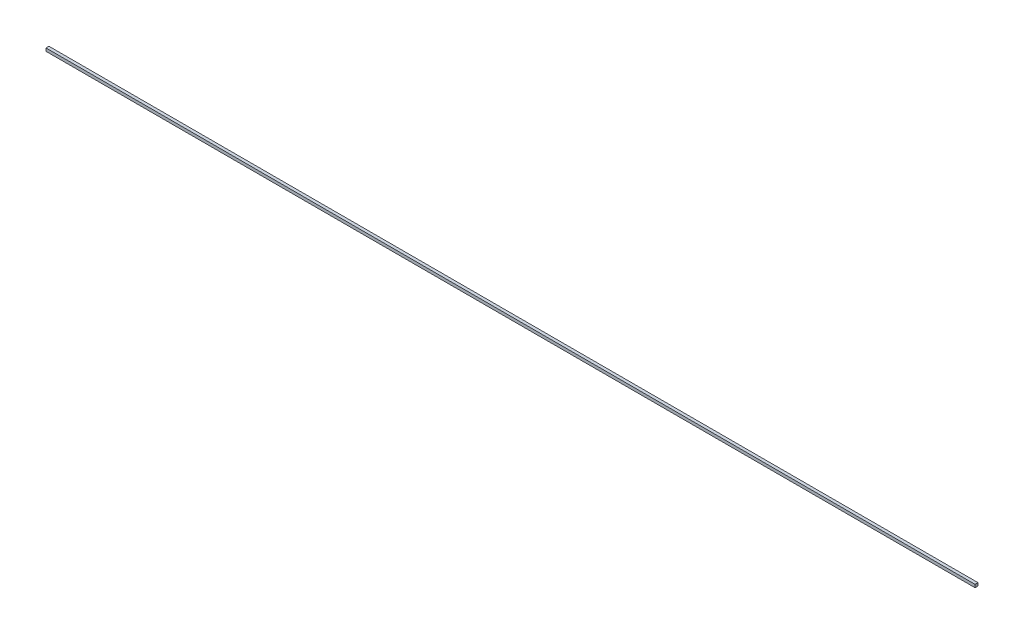
ISO-10303-21;
HEADER;
FILE_DESCRIPTION(('STEP AP214'),'2;1');
FILE_NAME('part.step','',(''),(''),'','','');
FILE_SCHEMA(('AUTOMOTIVE_DESIGN { 1 0 10303 214 1 1 1 1 }'));
ENDSEC;
DATA;
#1=APPLICATION_CONTEXT('core data for automotive mechanical design processes');
#2=APPLICATION_PROTOCOL_DEFINITION('international standard','automotive_design',2000,#1);
#3=PRODUCT_CONTEXT('',#1,'mechanical');
#4=PRODUCT('Part','Part','',(#3));
#5=PRODUCT_RELATED_PRODUCT_CATEGORY('part','',(#4));
#6=PRODUCT_DEFINITION_FORMATION('','',#4);
#7=PRODUCT_DEFINITION_CONTEXT('part definition',#1,'design');
#8=PRODUCT_DEFINITION('design','',#6,#7);
#9=PRODUCT_DEFINITION_SHAPE('','',#8);
#10=(LENGTH_UNIT() NAMED_UNIT(*) SI_UNIT(.MILLI.,.METRE.));
#11=(NAMED_UNIT(*) PLANE_ANGLE_UNIT() SI_UNIT($,.RADIAN.));
#12=(NAMED_UNIT(*) SI_UNIT($,.STERADIAN.) SOLID_ANGLE_UNIT());
#13=UNCERTAINTY_MEASURE_WITH_UNIT(LENGTH_MEASURE(1.E-05),#10,'distance_accuracy_value','');
#14=(GEOMETRIC_REPRESENTATION_CONTEXT(3) GLOBAL_UNCERTAINTY_ASSIGNED_CONTEXT((#13)) GLOBAL_UNIT_ASSIGNED_CONTEXT((#10,
#11,#12)) REPRESENTATION_CONTEXT('',''));
#15=CARTESIAN_POINT('',(0.,0.,0.));
#16=DIRECTION('',(0.,0.,1.));
#17=DIRECTION('',(1.,0.,0.));
#18=AXIS2_PLACEMENT_3D('',#15,#16,#17);
#19=CARTESIAN_POINT('',(500.,1.5875,-1.5875));
#20=DIRECTION('',(0.,0.,1.));
#21=DIRECTION('',(0.,-1.,0.));
#22=AXIS2_PLACEMENT_3D('',#19,#20,#21);
#23=PLANE('',#22);
#24=DIRECTION('',(0.,1.,0.));
#25=VECTOR('',#24,1.);
#26=CARTESIAN_POINT('',(-500.,1.5875,-1.5875));
#27=LINE('',#26,#25);
#28=CARTESIAN_POINT('',(-500.,-1.5875,-1.5875));
#29=VERTEX_POINT('',#28);
#30=CARTESIAN_POINT('',(-500.,1.5875,-1.5875));
#31=VERTEX_POINT('',#30);
#32=EDGE_CURVE('E105',#29,#31,#27,.T.);
#33=ORIENTED_EDGE('',*,*,#32,.T.);
#34=DIRECTION('',(-1.,0.,0.));
#35=VECTOR('',#34,1.);
#36=CARTESIAN_POINT('',(500.,1.5875,-1.5875));
#37=LINE('',#36,#35);
#38=CARTESIAN_POINT('',(500.,1.5875,-1.5875));
#39=VERTEX_POINT('',#38);
#40=EDGE_CURVE('E11',#39,#31,#37,.T.);
#41=ORIENTED_EDGE('',*,*,#40,.F.);
#42=DIRECTION('',(0.,1.,0.));
#43=VECTOR('',#42,1.);
#44=CARTESIAN_POINT('',(500.,1.5875,-1.5875));
#45=LINE('',#44,#43);
#46=CARTESIAN_POINT('',(500.,-1.5875,-1.5875));
#47=VERTEX_POINT('',#46);
#48=EDGE_CURVE('E89',#47,#39,#45,.T.);
#49=ORIENTED_EDGE('',*,*,#48,.F.);
#50=DIRECTION('',(-1.,0.,0.));
#51=VECTOR('',#50,1.);
#52=CARTESIAN_POINT('',(500.,-1.5875,-1.5875));
#53=LINE('',#52,#51);
#54=EDGE_CURVE('E98',#47,#29,#53,.T.);
#55=ORIENTED_EDGE('',*,*,#54,.T.);
#56=EDGE_LOOP('',(#33,#41,#49,#55));
#57=FACE_BOUND('',#56,.T.);
#58=ADVANCED_FACE('F39',(#57),#23,.F.);
#59=CARTESIAN_POINT('',(500.,1.5875,1.5875));
#60=DIRECTION('',(0.,-1.,0.));
#61=DIRECTION('',(0.,0.,-1.));
#62=AXIS2_PLACEMENT_3D('',#59,#60,#61);
#63=PLANE('',#62);
#64=DIRECTION('',(0.,0.,1.));
#65=VECTOR('',#64,1.);
#66=CARTESIAN_POINT('',(-500.,1.5875,1.5875));
#67=LINE('',#66,#65);
#68=CARTESIAN_POINT('',(-500.,1.5875,1.5875));
#69=VERTEX_POINT('',#68);
#70=EDGE_CURVE('E94',#31,#69,#67,.T.);
#71=ORIENTED_EDGE('',*,*,#70,.T.);
#72=DIRECTION('',(-1.,0.,0.));
#73=VECTOR('',#72,1.);
#74=CARTESIAN_POINT('',(500.,1.5875,1.5875));
#75=LINE('',#74,#73);
#76=CARTESIAN_POINT('',(500.,1.5875,1.5875));
#77=VERTEX_POINT('',#76);
#78=EDGE_CURVE('E50',#77,#69,#75,.T.);
#79=ORIENTED_EDGE('',*,*,#78,.F.);
#80=DIRECTION('',(0.,0.,1.));
#81=VECTOR('',#80,1.);
#82=CARTESIAN_POINT('',(500.,1.5875,1.5875));
#83=LINE('',#82,#81);
#84=EDGE_CURVE('E83',#39,#77,#83,.T.);
#85=ORIENTED_EDGE('',*,*,#84,.F.);
#86=ORIENTED_EDGE('',*,*,#40,.T.);
#87=EDGE_LOOP('',(#71,#79,#85,#86));
#88=FACE_BOUND('',#87,.T.);
#89=ADVANCED_FACE('F91',(#88),#63,.F.);
#90=CARTESIAN_POINT('',(500.,1.5875,1.5875));
#91=DIRECTION('',(0.,0.,-1.));
#92=DIRECTION('',(0.,1.,0.));
#93=AXIS2_PLACEMENT_3D('',#90,#91,#92);
#94=PLANE('',#93);
#95=DIRECTION('',(0.,-1.,0.));
#96=VECTOR('',#95,1.);
#97=CARTESIAN_POINT('',(-500.,1.5875,1.5875));
#98=LINE('',#97,#96);
#99=CARTESIAN_POINT('',(-500.,-1.5875,1.5875));
#100=VERTEX_POINT('',#99);
#101=EDGE_CURVE('E75',#69,#100,#98,.T.);
#102=ORIENTED_EDGE('',*,*,#101,.T.);
#103=DIRECTION('',(-1.,0.,0.));
#104=VECTOR('',#103,1.);
#105=CARTESIAN_POINT('',(500.,-1.5875,1.5875));
#106=LINE('',#105,#104);
#107=CARTESIAN_POINT('',(500.,-1.5875,1.5875));
#108=VERTEX_POINT('',#107);
#109=EDGE_CURVE('E92',#108,#100,#106,.T.);
#110=ORIENTED_EDGE('',*,*,#109,.F.);
#111=DIRECTION('',(0.,-1.,0.));
#112=VECTOR('',#111,1.);
#113=CARTESIAN_POINT('',(500.,1.5875,1.5875));
#114=LINE('',#113,#112);
#115=EDGE_CURVE('E86',#77,#108,#114,.T.);
#116=ORIENTED_EDGE('',*,*,#115,.F.);
#117=ORIENTED_EDGE('',*,*,#78,.T.);
#118=EDGE_LOOP('',(#102,#110,#116,#117));
#119=FACE_BOUND('',#118,.T.);
#120=ADVANCED_FACE('F96',(#119),#94,.F.);
#121=CARTESIAN_POINT('',(500.,-1.5875,1.5875));
#122=DIRECTION('',(0.,1.,0.));
#123=DIRECTION('',(0.,0.,1.));
#124=AXIS2_PLACEMENT_3D('',#121,#122,#123);
#125=PLANE('',#124);
#126=DIRECTION('',(0.,0.,-1.));
#127=VECTOR('',#126,1.);
#128=CARTESIAN_POINT('',(-500.,-1.5875,1.5875));
#129=LINE('',#128,#127);
#130=EDGE_CURVE('E79',#100,#29,#129,.T.);
#131=ORIENTED_EDGE('',*,*,#130,.T.);
#132=ORIENTED_EDGE('',*,*,#54,.F.);
#133=DIRECTION('',(0.,0.,-1.));
#134=VECTOR('',#133,1.);
#135=CARTESIAN_POINT('',(500.,-1.5875,1.5875));
#136=LINE('',#135,#134);
#137=EDGE_CURVE('E54',#108,#47,#136,.T.);
#138=ORIENTED_EDGE('',*,*,#137,.F.);
#139=ORIENTED_EDGE('',*,*,#109,.T.);
#140=EDGE_LOOP('',(#131,#132,#138,#139));
#141=FACE_BOUND('',#140,.T.);
#142=ADVANCED_FACE('F108',(#141),#125,.F.);
#143=CARTESIAN_POINT('',(500.,0.,0.));
#144=DIRECTION('',(1.,0.,0.));
#145=DIRECTION('',(0.,0.,-1.));
#146=AXIS2_PLACEMENT_3D('',#143,#144,#145);
#147=PLANE('',#146);
#148=ORIENTED_EDGE('',*,*,#48,.T.);
#149=ORIENTED_EDGE('',*,*,#84,.T.);
#150=ORIENTED_EDGE('',*,*,#115,.T.);
#151=ORIENTED_EDGE('',*,*,#137,.T.);
#152=EDGE_LOOP('',(#148,#149,#150,#151));
#153=FACE_BOUND('',#152,.T.);
#154=ADVANCED_FACE('F88',(#153),#147,.T.);
#155=CARTESIAN_POINT('',(-500.,0.,0.));
#156=DIRECTION('',(1.,0.,0.));
#157=DIRECTION('',(0.,0.,-1.));
#158=AXIS2_PLACEMENT_3D('',#155,#156,#157);
#159=PLANE('',#158);
#160=ORIENTED_EDGE('',*,*,#32,.F.);
#161=ORIENTED_EDGE('',*,*,#130,.F.);
#162=ORIENTED_EDGE('',*,*,#101,.F.);
#163=ORIENTED_EDGE('',*,*,#70,.F.);
#164=EDGE_LOOP('',(#160,#161,#162,#163));
#165=FACE_BOUND('',#164,.T.);
#166=ADVANCED_FACE('F115',(#165),#159,.F.);
#167=CLOSED_SHELL('',(#58,#89,#120,#142,#154,#166));
#168=MANIFOLD_SOLID_BREP('B2',#167);
#169=ADVANCED_BREP_SHAPE_REPRESENTATION('',(#18,#168),#14);
#170=SHAPE_DEFINITION_REPRESENTATION(#9,#169);
ENDSEC;
END-ISO-10303-21;
